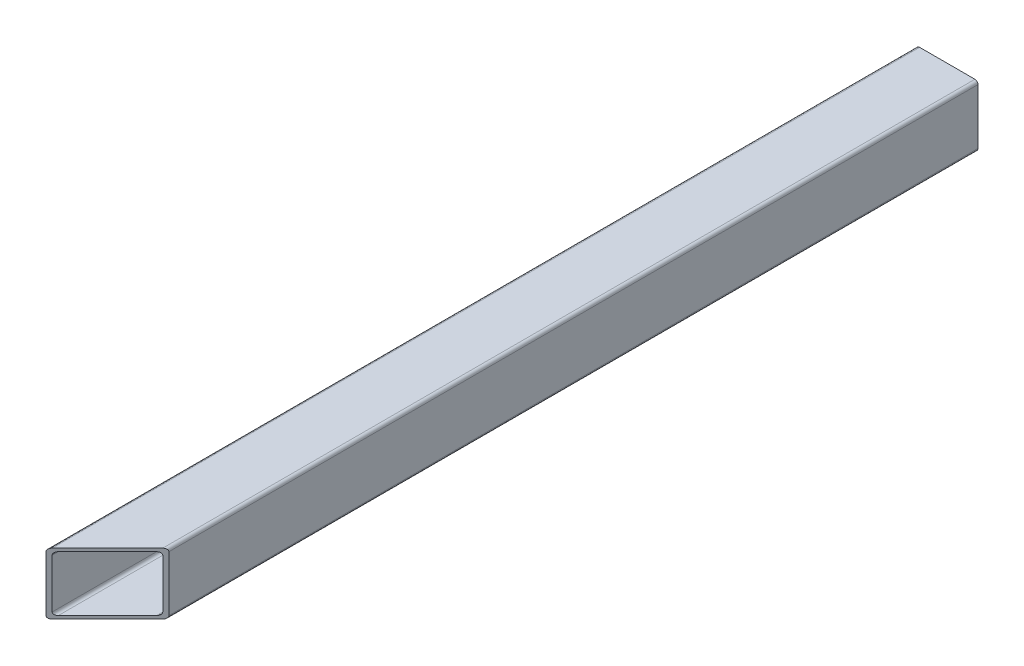
ISO-10303-21;
HEADER;
FILE_DESCRIPTION(('STEP AP214'),'2;1');
FILE_NAME('part.step','',(''),(''),'','','');
FILE_SCHEMA(('AUTOMOTIVE_DESIGN { 1 0 10303 214 1 1 1 1 }'));
ENDSEC;
DATA;
#1=APPLICATION_CONTEXT('core data for automotive mechanical design processes');
#2=APPLICATION_PROTOCOL_DEFINITION('international standard','automotive_design',2000,#1);
#3=PRODUCT_CONTEXT('',#1,'mechanical');
#4=PRODUCT('Part','Part','',(#3));
#5=PRODUCT_RELATED_PRODUCT_CATEGORY('part','',(#4));
#6=PRODUCT_DEFINITION_FORMATION('','',#4);
#7=PRODUCT_DEFINITION_CONTEXT('part definition',#1,'design');
#8=PRODUCT_DEFINITION('design','',#6,#7);
#9=PRODUCT_DEFINITION_SHAPE('','',#8);
#10=(LENGTH_UNIT() NAMED_UNIT(*) SI_UNIT(.MILLI.,.METRE.));
#11=(NAMED_UNIT(*) PLANE_ANGLE_UNIT() SI_UNIT($,.RADIAN.));
#12=(NAMED_UNIT(*) SI_UNIT($,.STERADIAN.) SOLID_ANGLE_UNIT());
#13=UNCERTAINTY_MEASURE_WITH_UNIT(LENGTH_MEASURE(1.E-05),#10,'distance_accuracy_value','');
#14=(GEOMETRIC_REPRESENTATION_CONTEXT(3) GLOBAL_UNCERTAINTY_ASSIGNED_CONTEXT((#13)) GLOBAL_UNIT_ASSIGNED_CONTEXT((#10,
#11,#12)) REPRESENTATION_CONTEXT('',''));
#15=CARTESIAN_POINT('',(0.,0.,0.));
#16=DIRECTION('',(0.,0.,1.));
#17=DIRECTION('',(1.,0.,0.));
#18=AXIS2_PLACEMENT_3D('',#15,#16,#17);
#19=CARTESIAN_POINT('',(3.,0.,850.));
#20=DIRECTION('',(-1.,0.,0.));
#21=DIRECTION('',(0.,0.,1.));
#22=AXIS2_PLACEMENT_3D('',#19,#20,#21);
#23=PLANE('',#22);
#24=DIRECTION('',(0.,1.,0.));
#25=VECTOR('',#24,1.);
#26=CARTESIAN_POINT('',(3.,0.,847.));
#27=LINE('',#26,#25);
#28=CARTESIAN_POINT('',(3.,6.00000000000002,847.));
#29=VERTEX_POINT('',#28);
#30=CARTESIAN_POINT('',(3.,54.,847.));
#31=VERTEX_POINT('',#30);
#32=EDGE_CURVE('E181',#29,#31,#27,.T.);
#33=ORIENTED_EDGE('',*,*,#32,.F.);
#34=DIRECTION('',(0.,0.,-1.));
#35=VECTOR('',#34,1.);
#36=CARTESIAN_POINT('',(3.,6.00000000000002,850.));
#37=LINE('',#36,#35);
#38=CARTESIAN_POINT('',(3.,6.00000000000002,0.));
#39=VERTEX_POINT('',#38);
#40=EDGE_CURVE('E120',#29,#39,#37,.T.);
#41=ORIENTED_EDGE('',*,*,#40,.T.);
#42=DIRECTION('',(0.,1.,0.));
#43=VECTOR('',#42,1.);
#44=CARTESIAN_POINT('',(3.,0.,0.));
#45=LINE('',#44,#43);
#46=CARTESIAN_POINT('',(3.,54.,0.));
#47=VERTEX_POINT('',#46);
#48=EDGE_CURVE('E135',#39,#47,#45,.T.);
#49=ORIENTED_EDGE('',*,*,#48,.T.);
#50=DIRECTION('',(0.,0.,-1.));
#51=VECTOR('',#50,1.);
#52=CARTESIAN_POINT('',(3.,54.,850.));
#53=LINE('',#52,#51);
#54=EDGE_CURVE('E11',#31,#47,#53,.T.);
#55=ORIENTED_EDGE('',*,*,#54,.F.);
#56=EDGE_LOOP('',(#33,#41,#49,#55));
#57=FACE_BOUND('',#56,.T.);
#58=ADVANCED_FACE('F32',(#57),#23,.F.);
#59=CARTESIAN_POINT('',(6.,54.,850.));
#60=DIRECTION('',(0.,0.,-1.));
#61=DIRECTION('',(-1.,0.,0.));
#62=AXIS2_PLACEMENT_3D('',#59,#60,#61);
#63=CYLINDRICAL_SURFACE('',#62,3.);
#64=CARTESIAN_POINT('',(6.,54.,844.));
#65=DIRECTION('',(0.707106781186549,0.,0.707106781186546));
#66=DIRECTION('',(0.707106781186546,0.,-0.707106781186549));
#67=AXIS2_PLACEMENT_3D('',#64,#65,#66);
#68=ELLIPSE('',#67,4.24264068711929,3.);
#69=CARTESIAN_POINT('',(6.00000000000002,57.,844.));
#70=VERTEX_POINT('',#69);
#71=EDGE_CURVE('E247',#31,#70,#68,.F.);
#72=ORIENTED_EDGE('',*,*,#71,.F.);
#73=ORIENTED_EDGE('',*,*,#54,.T.);
#74=CARTESIAN_POINT('',(6.,54.,0.));
#75=DIRECTION('',(0.,0.,1.));
#76=DIRECTION('',(1.,0.,0.));
#77=AXIS2_PLACEMENT_3D('',#74,#75,#76);
#78=CIRCLE('',#77,3.);
#79=CARTESIAN_POINT('',(6.00000000000002,57.,0.));
#80=VERTEX_POINT('',#79);
#81=EDGE_CURVE('E203',#47,#80,#78,.F.);
#82=ORIENTED_EDGE('',*,*,#81,.T.);
#83=DIRECTION('',(0.,0.,-1.));
#84=VECTOR('',#83,1.);
#85=CARTESIAN_POINT('',(6.00000000000002,57.,850.));
#86=LINE('',#85,#84);
#87=EDGE_CURVE('E41',#70,#80,#86,.T.);
#88=ORIENTED_EDGE('',*,*,#87,.F.);
#89=EDGE_LOOP('',(#72,#73,#82,#88));
#90=FACE_BOUND('',#89,.T.);
#91=ADVANCED_FACE('F244',(#90),#63,.F.);
#92=CARTESIAN_POINT('',(0.,57.,850.));
#93=DIRECTION('',(0.,1.,0.));
#94=DIRECTION('',(0.,0.,1.));
#95=AXIS2_PLACEMENT_3D('',#92,#93,#94);
#96=PLANE('',#95);
#97=DIRECTION('',(0.707106781186546,0.,-0.707106781186549));
#98=VECTOR('',#97,1.);
#99=CARTESIAN_POINT('',(1.96261557335472E-13,57.,850.));
#100=LINE('',#99,#98);
#101=CARTESIAN_POINT('',(54.,57.,796.));
#102=VERTEX_POINT('',#101);
#103=EDGE_CURVE('E241',#70,#102,#100,.T.);
#104=ORIENTED_EDGE('',*,*,#103,.F.);
#105=ORIENTED_EDGE('',*,*,#87,.T.);
#106=DIRECTION('',(1.,0.,0.));
#107=VECTOR('',#106,1.);
#108=CARTESIAN_POINT('',(0.,57.,0.));
#109=LINE('',#108,#107);
#110=CARTESIAN_POINT('',(54.,57.,0.));
#111=VERTEX_POINT('',#110);
#112=EDGE_CURVE('E206',#80,#111,#109,.T.);
#113=ORIENTED_EDGE('',*,*,#112,.T.);
#114=DIRECTION('',(0.,0.,-1.));
#115=VECTOR('',#114,1.);
#116=CARTESIAN_POINT('',(54.,57.,850.));
#117=LINE('',#116,#115);
#118=EDGE_CURVE('E149',#102,#111,#117,.T.);
#119=ORIENTED_EDGE('',*,*,#118,.F.);
#120=EDGE_LOOP('',(#104,#105,#113,#119));
#121=FACE_BOUND('',#120,.T.);
#122=ADVANCED_FACE('F236',(#121),#96,.F.);
#123=CARTESIAN_POINT('',(54.,54.,850.));
#124=DIRECTION('',(0.,0.,-1.));
#125=DIRECTION('',(-1.,0.,0.));
#126=AXIS2_PLACEMENT_3D('',#123,#124,#125);
#127=CYLINDRICAL_SURFACE('',#126,3.);
#128=CARTESIAN_POINT('',(54.,54.,796.));
#129=DIRECTION('',(0.707106781186549,0.,0.707106781186546));
#130=DIRECTION('',(0.707106781186546,0.,-0.707106781186549));
#131=AXIS2_PLACEMENT_3D('',#128,#129,#130);
#132=ELLIPSE('',#131,4.2426406871193,3.);
#133=CARTESIAN_POINT('',(57.,54.,793.));
#134=VERTEX_POINT('',#133);
#135=EDGE_CURVE('E302',#102,#134,#132,.F.);
#136=ORIENTED_EDGE('',*,*,#135,.F.);
#137=ORIENTED_EDGE('',*,*,#118,.T.);
#138=CARTESIAN_POINT('',(54.,54.,0.));
#139=DIRECTION('',(0.,0.,1.));
#140=DIRECTION('',(1.,0.,0.));
#141=AXIS2_PLACEMENT_3D('',#138,#139,#140);
#142=CIRCLE('',#141,3.);
#143=CARTESIAN_POINT('',(57.,54.,0.));
#144=VERTEX_POINT('',#143);
#145=EDGE_CURVE('E209',#111,#144,#142,.F.);
#146=ORIENTED_EDGE('',*,*,#145,.T.);
#147=DIRECTION('',(0.,0.,-1.));
#148=VECTOR('',#147,1.);
#149=CARTESIAN_POINT('',(57.,54.,850.));
#150=LINE('',#149,#148);
#151=EDGE_CURVE('E147',#134,#144,#150,.T.);
#152=ORIENTED_EDGE('',*,*,#151,.F.);
#153=EDGE_LOOP('',(#136,#137,#146,#152));
#154=FACE_BOUND('',#153,.T.);
#155=ADVANCED_FACE('F231',(#154),#127,.F.);
#156=CARTESIAN_POINT('',(57.,0.,850.));
#157=DIRECTION('',(-1.,0.,0.));
#158=DIRECTION('',(0.,0.,1.));
#159=AXIS2_PLACEMENT_3D('',#156,#157,#158);
#160=PLANE('',#159);
#161=DIRECTION('',(0.,0.,-1.));
#162=VECTOR('',#161,1.);
#163=CARTESIAN_POINT('',(57.,6.00000000000002,850.));
#164=LINE('',#163,#162);
#165=CARTESIAN_POINT('',(57.,6.00000000000002,793.));
#166=VERTEX_POINT('',#165);
#167=CARTESIAN_POINT('',(57.,6.00000000000002,0.));
#168=VERTEX_POINT('',#167);
#169=EDGE_CURVE('E145',#166,#168,#164,.T.);
#170=ORIENTED_EDGE('',*,*,#169,.F.);
#171=DIRECTION('',(0.,1.,0.));
#172=VECTOR('',#171,1.);
#173=CARTESIAN_POINT('',(57.,0.,793.));
#174=LINE('',#173,#172);
#175=EDGE_CURVE('E228',#166,#134,#174,.T.);
#176=ORIENTED_EDGE('',*,*,#175,.T.);
#177=ORIENTED_EDGE('',*,*,#151,.T.);
#178=DIRECTION('',(0.,1.,0.));
#179=VECTOR('',#178,1.);
#180=CARTESIAN_POINT('',(57.,0.,0.));
#181=LINE('',#180,#179);
#182=EDGE_CURVE('E212',#168,#144,#181,.T.);
#183=ORIENTED_EDGE('',*,*,#182,.F.);
#184=EDGE_LOOP('',(#170,#176,#177,#183));
#185=FACE_BOUND('',#184,.T.);
#186=ADVANCED_FACE('F222',(#185),#160,.T.);
#187=CARTESIAN_POINT('',(54.,6.,850.));
#188=DIRECTION('',(0.,0.,-1.));
#189=DIRECTION('',(-1.,0.,0.));
#190=AXIS2_PLACEMENT_3D('',#187,#188,#189);
#191=CYLINDRICAL_SURFACE('',#190,3.);
#192=CARTESIAN_POINT('',(54.,6.,796.));
#193=DIRECTION('',(0.707106781186549,0.,0.707106781186546));
#194=DIRECTION('',(0.707106781186546,0.,-0.707106781186549));
#195=AXIS2_PLACEMENT_3D('',#192,#193,#194);
#196=ELLIPSE('',#195,4.24264068711929,3.);
#197=CARTESIAN_POINT('',(54.,3.,796.));
#198=VERTEX_POINT('',#197);
#199=EDGE_CURVE('E299',#166,#198,#196,.F.);
#200=ORIENTED_EDGE('',*,*,#199,.F.);
#201=ORIENTED_EDGE('',*,*,#169,.T.);
#202=CARTESIAN_POINT('',(54.,6.,0.));
#203=DIRECTION('',(0.,0.,1.));
#204=DIRECTION('',(1.,0.,0.));
#205=AXIS2_PLACEMENT_3D('',#202,#203,#204);
#206=CIRCLE('',#205,3.);
#207=CARTESIAN_POINT('',(54.,3.,0.));
#208=VERTEX_POINT('',#207);
#209=EDGE_CURVE('E129',#168,#208,#206,.F.);
#210=ORIENTED_EDGE('',*,*,#209,.T.);
#211=DIRECTION('',(0.,0.,-1.));
#212=VECTOR('',#211,1.);
#213=CARTESIAN_POINT('',(54.,3.,850.));
#214=LINE('',#213,#212);
#215=EDGE_CURVE('E119',#198,#208,#214,.T.);
#216=ORIENTED_EDGE('',*,*,#215,.F.);
#217=EDGE_LOOP('',(#200,#201,#210,#216));
#218=FACE_BOUND('',#217,.T.);
#219=ADVANCED_FACE('F216',(#218),#191,.F.);
#220=CARTESIAN_POINT('',(0.,3.,850.));
#221=DIRECTION('',(0.,1.,0.));
#222=DIRECTION('',(0.,0.,1.));
#223=AXIS2_PLACEMENT_3D('',#220,#221,#222);
#224=PLANE('',#223);
#225=DIRECTION('',(0.,0.,-1.));
#226=VECTOR('',#225,1.);
#227=CARTESIAN_POINT('',(6.00000000000002,3.,850.));
#228=LINE('',#227,#226);
#229=CARTESIAN_POINT('',(6.00000000000002,3.,844.));
#230=VERTEX_POINT('',#229);
#231=CARTESIAN_POINT('',(6.00000000000002,3.,0.));
#232=VERTEX_POINT('',#231);
#233=EDGE_CURVE('E111',#230,#232,#228,.T.);
#234=ORIENTED_EDGE('',*,*,#233,.F.);
#235=DIRECTION('',(0.707106781186546,0.,-0.707106781186549));
#236=VECTOR('',#235,1.);
#237=CARTESIAN_POINT('',(1.96261557335472E-13,3.,850.));
#238=LINE('',#237,#236);
#239=EDGE_CURVE('E49',#230,#198,#238,.T.);
#240=ORIENTED_EDGE('',*,*,#239,.T.);
#241=ORIENTED_EDGE('',*,*,#215,.T.);
#242=DIRECTION('',(1.,0.,0.));
#243=VECTOR('',#242,1.);
#244=CARTESIAN_POINT('',(0.,3.,0.));
#245=LINE('',#244,#243);
#246=EDGE_CURVE('E123',#232,#208,#245,.T.);
#247=ORIENTED_EDGE('',*,*,#246,.F.);
#248=EDGE_LOOP('',(#234,#240,#241,#247));
#249=FACE_BOUND('',#248,.T.);
#250=ADVANCED_FACE('F124',(#249),#224,.T.);
#251=CARTESIAN_POINT('',(3.,57.,850.));
#252=DIRECTION('',(0.,0.,-1.));
#253=DIRECTION('',(-1.,0.,0.));
#254=AXIS2_PLACEMENT_3D('',#251,#252,#253);
#255=CYLINDRICAL_SURFACE('',#254,3.);
#256=DIRECTION('',(0.,0.,-1.));
#257=VECTOR('',#256,1.);
#258=CARTESIAN_POINT('',(0.,57.,850.));
#259=LINE('',#258,#257);
#260=CARTESIAN_POINT('',(0.,57.,850.));
#261=VERTEX_POINT('',#260);
#262=CARTESIAN_POINT('',(0.,57.,0.));
#263=VERTEX_POINT('',#262);
#264=EDGE_CURVE('E36',#261,#263,#259,.T.);
#265=ORIENTED_EDGE('',*,*,#264,.F.);
#266=CARTESIAN_POINT('',(3.,57.,847.));
#267=DIRECTION('',(0.707106781186549,0.,0.707106781186546));
#268=DIRECTION('',(0.707106781186546,0.,-0.707106781186549));
#269=AXIS2_PLACEMENT_3D('',#266,#267,#268);
#270=ELLIPSE('',#269,4.24264068711929,3.);
#271=CARTESIAN_POINT('',(3.00000000000002,60.,847.));
#272=VERTEX_POINT('',#271);
#273=EDGE_CURVE('E58',#261,#272,#270,.F.);
#274=ORIENTED_EDGE('',*,*,#273,.T.);
#275=DIRECTION('',(0.,0.,-1.));
#276=VECTOR('',#275,1.);
#277=CARTESIAN_POINT('',(3.00000000000002,60.,850.));
#278=LINE('',#277,#276);
#279=CARTESIAN_POINT('',(3.00000000000002,60.,0.));
#280=VERTEX_POINT('',#279);
#281=EDGE_CURVE('E139',#272,#280,#278,.T.);
#282=ORIENTED_EDGE('',*,*,#281,.T.);
#283=CARTESIAN_POINT('',(3.,57.,0.));
#284=DIRECTION('',(0.,0.,1.));
#285=DIRECTION('',(1.,0.,0.));
#286=AXIS2_PLACEMENT_3D('',#283,#284,#285);
#287=CIRCLE('',#286,3.);
#288=EDGE_CURVE('E176',#263,#280,#287,.F.);
#289=ORIENTED_EDGE('',*,*,#288,.F.);
#290=EDGE_LOOP('',(#265,#274,#282,#289));
#291=FACE_BOUND('',#290,.T.);
#292=ADVANCED_FACE('F34',(#291),#255,.T.);
#293=CARTESIAN_POINT('',(3.,3.,850.));
#294=DIRECTION('',(0.,0.,-1.));
#295=DIRECTION('',(-1.,0.,0.));
#296=AXIS2_PLACEMENT_3D('',#293,#294,#295);
#297=CYLINDRICAL_SURFACE('',#296,3.);
#298=DIRECTION('',(0.,0.,-1.));
#299=VECTOR('',#298,1.);
#300=CARTESIAN_POINT('',(3.00000000000002,0.,850.));
#301=LINE('',#300,#299);
#302=CARTESIAN_POINT('',(3.00000000000002,0.,847.));
#303=VERTEX_POINT('',#302);
#304=CARTESIAN_POINT('',(3.00000000000002,0.,0.));
#305=VERTEX_POINT('',#304);
#306=EDGE_CURVE('E161',#303,#305,#301,.T.);
#307=ORIENTED_EDGE('',*,*,#306,.F.);
#308=CARTESIAN_POINT('',(3.,3.,847.));
#309=DIRECTION('',(0.707106781186549,0.,0.707106781186546));
#310=DIRECTION('',(0.707106781186546,0.,-0.707106781186549));
#311=AXIS2_PLACEMENT_3D('',#308,#309,#310);
#312=ELLIPSE('',#311,4.24264068711929,3.);
#313=CARTESIAN_POINT('',(3.92523114670943E-13,3.00000000000002,850.));
#314=VERTEX_POINT('',#313);
#315=EDGE_CURVE('E278',#303,#314,#312,.F.);
#316=ORIENTED_EDGE('',*,*,#315,.T.);
#317=DIRECTION('',(0.,0.,-1.));
#318=VECTOR('',#317,1.);
#319=CARTESIAN_POINT('',(0.,3.00000000000002,850.));
#320=LINE('',#319,#318);
#321=CARTESIAN_POINT('',(0.,3.00000000000002,0.));
#322=VERTEX_POINT('',#321);
#323=EDGE_CURVE('E162',#314,#322,#320,.T.);
#324=ORIENTED_EDGE('',*,*,#323,.T.);
#325=CARTESIAN_POINT('',(3.,3.,0.));
#326=DIRECTION('',(0.,0.,1.));
#327=DIRECTION('',(1.,0.,0.));
#328=AXIS2_PLACEMENT_3D('',#325,#326,#327);
#329=CIRCLE('',#328,3.);
#330=EDGE_CURVE('E184',#305,#322,#329,.F.);
#331=ORIENTED_EDGE('',*,*,#330,.F.);
#332=EDGE_LOOP('',(#307,#316,#324,#331));
#333=FACE_BOUND('',#332,.T.);
#334=ADVANCED_FACE('F281',(#333),#297,.T.);
#335=CARTESIAN_POINT('',(0.,0.,850.));
#336=DIRECTION('',(0.,1.,0.));
#337=DIRECTION('',(0.,0.,1.));
#338=AXIS2_PLACEMENT_3D('',#335,#336,#337);
#339=PLANE('',#338);
#340=DIRECTION('',(0.707106781186546,0.,-0.707106781186549));
#341=VECTOR('',#340,1.);
#342=CARTESIAN_POINT('',(1.96261557335472E-13,0.,850.));
#343=LINE('',#342,#341);
#344=CARTESIAN_POINT('',(57.,0.,793.));
#345=VERTEX_POINT('',#344);
#346=EDGE_CURVE('E282',#303,#345,#343,.T.);
#347=ORIENTED_EDGE('',*,*,#346,.F.);
#348=ORIENTED_EDGE('',*,*,#306,.T.);
#349=DIRECTION('',(1.,0.,0.));
#350=VECTOR('',#349,1.);
#351=CARTESIAN_POINT('',(0.,0.,0.));
#352=LINE('',#351,#350);
#353=CARTESIAN_POINT('',(57.,0.,0.));
#354=VERTEX_POINT('',#353);
#355=EDGE_CURVE('E186',#305,#354,#352,.T.);
#356=ORIENTED_EDGE('',*,*,#355,.T.);
#357=DIRECTION('',(0.,0.,-1.));
#358=VECTOR('',#357,1.);
#359=CARTESIAN_POINT('',(57.,0.,850.));
#360=LINE('',#359,#358);
#361=EDGE_CURVE('E159',#345,#354,#360,.T.);
#362=ORIENTED_EDGE('',*,*,#361,.F.);
#363=EDGE_LOOP('',(#347,#348,#356,#362));
#364=FACE_BOUND('',#363,.T.);
#365=ADVANCED_FACE('F335',(#364),#339,.F.);
#366=CARTESIAN_POINT('',(57.,3.,850.));
#367=DIRECTION('',(0.,0.,-1.));
#368=DIRECTION('',(-1.,0.,0.));
#369=AXIS2_PLACEMENT_3D('',#366,#367,#368);
#370=CYLINDRICAL_SURFACE('',#369,3.);
#371=CARTESIAN_POINT('',(57.,3.,793.));
#372=DIRECTION('',(0.707106781186549,0.,0.707106781186546));
#373=DIRECTION('',(0.707106781186546,0.,-0.707106781186549));
#374=AXIS2_PLACEMENT_3D('',#371,#372,#373);
#375=ELLIPSE('',#374,4.24264068711929,3.);
#376=CARTESIAN_POINT('',(60.,3.00000000000002,790.));
#377=VERTEX_POINT('',#376);
#378=EDGE_CURVE('E284',#345,#377,#375,.T.);
#379=ORIENTED_EDGE('',*,*,#378,.F.);
#380=ORIENTED_EDGE('',*,*,#361,.T.);
#381=CARTESIAN_POINT('',(57.,3.,0.));
#382=DIRECTION('',(0.,0.,1.));
#383=DIRECTION('',(1.,0.,0.));
#384=AXIS2_PLACEMENT_3D('',#381,#382,#383);
#385=CIRCLE('',#384,3.);
#386=CARTESIAN_POINT('',(60.,3.00000000000002,0.));
#387=VERTEX_POINT('',#386);
#388=EDGE_CURVE('E191',#354,#387,#385,.T.);
#389=ORIENTED_EDGE('',*,*,#388,.T.);
#390=DIRECTION('',(0.,0.,-1.));
#391=VECTOR('',#390,1.);
#392=CARTESIAN_POINT('',(60.,3.00000000000002,850.));
#393=LINE('',#392,#391);
#394=EDGE_CURVE('E157',#377,#387,#393,.T.);
#395=ORIENTED_EDGE('',*,*,#394,.F.);
#396=EDGE_LOOP('',(#379,#380,#389,#395));
#397=FACE_BOUND('',#396,.T.);
#398=ADVANCED_FACE('F331',(#397),#370,.T.);
#399=CARTESIAN_POINT('',(60.,0.,850.));
#400=DIRECTION('',(-1.,0.,0.));
#401=DIRECTION('',(0.,0.,1.));
#402=AXIS2_PLACEMENT_3D('',#399,#400,#401);
#403=PLANE('',#402);
#404=DIRECTION('',(0.,1.,0.));
#405=VECTOR('',#404,1.);
#406=CARTESIAN_POINT('',(60.,0.,790.));
#407=LINE('',#406,#405);
#408=CARTESIAN_POINT('',(60.,57.,790.));
#409=VERTEX_POINT('',#408);
#410=EDGE_CURVE('E288',#377,#409,#407,.T.);
#411=ORIENTED_EDGE('',*,*,#410,.F.);
#412=ORIENTED_EDGE('',*,*,#394,.T.);
#413=DIRECTION('',(0.,1.,0.));
#414=VECTOR('',#413,1.);
#415=CARTESIAN_POINT('',(60.,0.,0.));
#416=LINE('',#415,#414);
#417=CARTESIAN_POINT('',(60.,57.,0.));
#418=VERTEX_POINT('',#417);
#419=EDGE_CURVE('E194',#387,#418,#416,.T.);
#420=ORIENTED_EDGE('',*,*,#419,.T.);
#421=DIRECTION('',(0.,0.,-1.));
#422=VECTOR('',#421,1.);
#423=CARTESIAN_POINT('',(60.,57.,850.));
#424=LINE('',#423,#422);
#425=EDGE_CURVE('E155',#409,#418,#424,.T.);
#426=ORIENTED_EDGE('',*,*,#425,.F.);
#427=EDGE_LOOP('',(#411,#412,#420,#426));
#428=FACE_BOUND('',#427,.T.);
#429=ADVANCED_FACE('F327',(#428),#403,.F.);
#430=CARTESIAN_POINT('',(57.,57.,850.));
#431=DIRECTION('',(0.,0.,-1.));
#432=DIRECTION('',(-1.,0.,0.));
#433=AXIS2_PLACEMENT_3D('',#430,#431,#432);
#434=CYLINDRICAL_SURFACE('',#433,3.);
#435=DIRECTION('',(0.,0.,-1.));
#436=VECTOR('',#435,1.);
#437=CARTESIAN_POINT('',(57.,60.,850.));
#438=LINE('',#437,#436);
#439=CARTESIAN_POINT('',(57.,60.,793.));
#440=VERTEX_POINT('',#439);
#441=CARTESIAN_POINT('',(57.,60.,0.));
#442=VERTEX_POINT('',#441);
#443=EDGE_CURVE('E153',#440,#442,#438,.T.);
#444=ORIENTED_EDGE('',*,*,#443,.F.);
#445=CARTESIAN_POINT('',(57.,57.,793.));
#446=DIRECTION('',(0.707106781186549,0.,0.707106781186546));
#447=DIRECTION('',(0.707106781186546,0.,-0.707106781186549));
#448=AXIS2_PLACEMENT_3D('',#445,#446,#447);
#449=ELLIPSE('',#448,4.2426406871193,3.);
#450=EDGE_CURVE('E290',#440,#409,#449,.F.);
#451=ORIENTED_EDGE('',*,*,#450,.T.);
#452=ORIENTED_EDGE('',*,*,#425,.T.);
#453=CARTESIAN_POINT('',(57.,57.,0.));
#454=DIRECTION('',(0.,0.,1.));
#455=DIRECTION('',(1.,0.,0.));
#456=AXIS2_PLACEMENT_3D('',#453,#454,#455);
#457=CIRCLE('',#456,3.);
#458=EDGE_CURVE('E197',#442,#418,#457,.F.);
#459=ORIENTED_EDGE('',*,*,#458,.F.);
#460=EDGE_LOOP('',(#444,#451,#452,#459));
#461=FACE_BOUND('',#460,.T.);
#462=ADVANCED_FACE('F323',(#461),#434,.T.);
#463=CARTESIAN_POINT('',(0.,60.,850.));
#464=DIRECTION('',(0.,1.,0.));
#465=DIRECTION('',(0.,0.,1.));
#466=AXIS2_PLACEMENT_3D('',#463,#464,#465);
#467=PLANE('',#466);
#468=ORIENTED_EDGE('',*,*,#281,.F.);
#469=DIRECTION('',(0.707106781186546,0.,-0.707106781186549));
#470=VECTOR('',#469,1.);
#471=CARTESIAN_POINT('',(1.96261557335472E-13,60.,850.));
#472=LINE('',#471,#470);
#473=EDGE_CURVE('E293',#272,#440,#472,.T.);
#474=ORIENTED_EDGE('',*,*,#473,.T.);
#475=ORIENTED_EDGE('',*,*,#443,.T.);
#476=DIRECTION('',(1.,0.,0.));
#477=VECTOR('',#476,1.);
#478=CARTESIAN_POINT('',(0.,60.,0.));
#479=LINE('',#478,#477);
#480=EDGE_CURVE('E200',#280,#442,#479,.T.);
#481=ORIENTED_EDGE('',*,*,#480,.F.);
#482=EDGE_LOOP('',(#468,#474,#475,#481));
#483=FACE_BOUND('',#482,.T.);
#484=ADVANCED_FACE('F320',(#483),#467,.T.);
#485=CARTESIAN_POINT('',(6.,6.,850.));
#486=DIRECTION('',(0.,0.,-1.));
#487=DIRECTION('',(-1.,0.,0.));
#488=AXIS2_PLACEMENT_3D('',#485,#486,#487);
#489=CYLINDRICAL_SURFACE('',#488,3.);
#490=ORIENTED_EDGE('',*,*,#40,.F.);
#491=CARTESIAN_POINT('',(6.,6.,844.));
#492=DIRECTION('',(0.707106781186549,0.,0.707106781186546));
#493=DIRECTION('',(0.707106781186546,0.,-0.707106781186549));
#494=AXIS2_PLACEMENT_3D('',#491,#492,#493);
#495=ELLIPSE('',#494,4.24264068711929,3.);
#496=EDGE_CURVE('E117',#29,#230,#495,.T.);
#497=ORIENTED_EDGE('',*,*,#496,.T.);
#498=ORIENTED_EDGE('',*,*,#233,.T.);
#499=CARTESIAN_POINT('',(6.,6.,0.));
#500=DIRECTION('',(0.,0.,1.));
#501=DIRECTION('',(1.,0.,0.));
#502=AXIS2_PLACEMENT_3D('',#499,#500,#501);
#503=CIRCLE('',#502,3.);
#504=EDGE_CURVE('E116',#39,#232,#503,.T.);
#505=ORIENTED_EDGE('',*,*,#504,.F.);
#506=EDGE_LOOP('',(#490,#497,#498,#505));
#507=FACE_BOUND('',#506,.T.);
#508=ADVANCED_FACE('F114',(#507),#489,.F.);
#509=CARTESIAN_POINT('',(0.,0.,850.));
#510=DIRECTION('',(-1.,0.,0.));
#511=DIRECTION('',(0.,0.,1.));
#512=AXIS2_PLACEMENT_3D('',#509,#510,#511);
#513=PLANE('',#512);
#514=DIRECTION('',(0.,1.,0.));
#515=VECTOR('',#514,1.);
#516=CARTESIAN_POINT('',(0.,0.,0.));
#517=LINE('',#516,#515);
#518=EDGE_CURVE('E172',#322,#263,#517,.T.);
#519=ORIENTED_EDGE('',*,*,#518,.F.);
#520=ORIENTED_EDGE('',*,*,#323,.F.);
#521=DIRECTION('',(0.,1.,0.));
#522=VECTOR('',#521,1.);
#523=CARTESIAN_POINT('',(0.,0.,850.));
#524=LINE('',#523,#522);
#525=EDGE_CURVE('E136',#314,#261,#524,.T.);
#526=ORIENTED_EDGE('',*,*,#525,.T.);
#527=ORIENTED_EDGE('',*,*,#264,.T.);
#528=EDGE_LOOP('',(#519,#520,#526,#527));
#529=FACE_BOUND('',#528,.T.);
#530=ADVANCED_FACE('F170',(#529),#513,.T.);
#531=CARTESIAN_POINT('',(0.,0.,0.));
#532=DIRECTION('',(0.,0.,1.));
#533=DIRECTION('',(1.,0.,0.));
#534=AXIS2_PLACEMENT_3D('',#531,#532,#533);
#535=PLANE('',#534);
#536=ORIENTED_EDGE('',*,*,#288,.T.);
#537=ORIENTED_EDGE('',*,*,#480,.T.);
#538=ORIENTED_EDGE('',*,*,#458,.T.);
#539=ORIENTED_EDGE('',*,*,#419,.F.);
#540=ORIENTED_EDGE('',*,*,#388,.F.);
#541=ORIENTED_EDGE('',*,*,#355,.F.);
#542=ORIENTED_EDGE('',*,*,#330,.T.);
#543=ORIENTED_EDGE('',*,*,#518,.T.);
#544=EDGE_LOOP('',(#536,#537,#538,#539,#540,#541,#542,#543));
#545=FACE_BOUND('',#544,.T.);
#546=ORIENTED_EDGE('',*,*,#48,.F.);
#547=ORIENTED_EDGE('',*,*,#504,.T.);
#548=ORIENTED_EDGE('',*,*,#246,.T.);
#549=ORIENTED_EDGE('',*,*,#209,.F.);
#550=ORIENTED_EDGE('',*,*,#182,.T.);
#551=ORIENTED_EDGE('',*,*,#145,.F.);
#552=ORIENTED_EDGE('',*,*,#112,.F.);
#553=ORIENTED_EDGE('',*,*,#81,.F.);
#554=EDGE_LOOP('',(#546,#547,#548,#549,#550,#551,#552,#553));
#555=FACE_BOUND('',#554,.T.);
#556=ADVANCED_FACE('F132',(#545,#555),#535,.F.);
#557=CARTESIAN_POINT('',(425.,0.,424.999999999999));
#558=DIRECTION('',(0.707106781186549,0.,0.707106781186546));
#559=DIRECTION('',(0.707106781186546,0.,-0.707106781186549));
#560=AXIS2_PLACEMENT_3D('',#557,#558,#559);
#561=PLANE('',#560);
#562=ORIENTED_EDGE('',*,*,#525,.F.);
#563=ORIENTED_EDGE('',*,*,#315,.F.);
#564=ORIENTED_EDGE('',*,*,#346,.T.);
#565=ORIENTED_EDGE('',*,*,#378,.T.);
#566=ORIENTED_EDGE('',*,*,#410,.T.);
#567=ORIENTED_EDGE('',*,*,#450,.F.);
#568=ORIENTED_EDGE('',*,*,#473,.F.);
#569=ORIENTED_EDGE('',*,*,#273,.F.);
#570=EDGE_LOOP('',(#562,#563,#564,#565,#566,#567,#568,#569));
#571=FACE_BOUND('',#570,.T.);
#572=ORIENTED_EDGE('',*,*,#32,.T.);
#573=ORIENTED_EDGE('',*,*,#71,.T.);
#574=ORIENTED_EDGE('',*,*,#103,.T.);
#575=ORIENTED_EDGE('',*,*,#135,.T.);
#576=ORIENTED_EDGE('',*,*,#175,.F.);
#577=ORIENTED_EDGE('',*,*,#199,.T.);
#578=ORIENTED_EDGE('',*,*,#239,.F.);
#579=ORIENTED_EDGE('',*,*,#496,.F.);
#580=EDGE_LOOP('',(#572,#573,#574,#575,#576,#577,#578,#579));
#581=FACE_BOUND('',#580,.T.);
#582=ADVANCED_FACE('F277',(#571,#581),#561,.T.);
#583=CLOSED_SHELL('',(#58,#91,#122,#155,#186,#219,#250,#292,#334,#365,#398,#429,#462,#484,#508,
#530,#556,#582));
#584=MANIFOLD_SOLID_BREP('B2',#583);
#585=ADVANCED_BREP_SHAPE_REPRESENTATION('',(#18,#584),#14);
#586=SHAPE_DEFINITION_REPRESENTATION(#9,#585);
ENDSEC;
END-ISO-10303-21;
